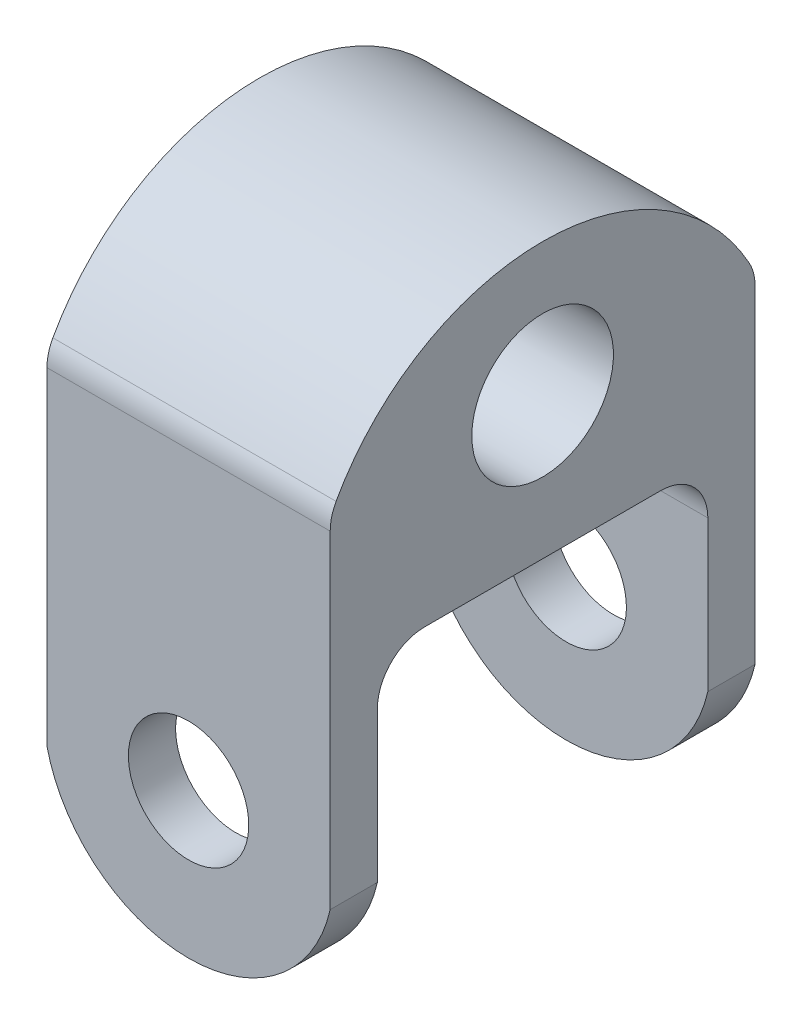
ISO-10303-21;
HEADER;
FILE_DESCRIPTION(('STEP AP214'),'2;1');
FILE_NAME('part.step','',(''),(''),'','','');
FILE_SCHEMA(('AUTOMOTIVE_DESIGN { 1 0 10303 214 1 1 1 1 }'));
ENDSEC;
DATA;
#1=APPLICATION_CONTEXT('core data for automotive mechanical design processes');
#2=APPLICATION_PROTOCOL_DEFINITION('international standard','automotive_design',2000,#1);
#3=PRODUCT_CONTEXT('',#1,'mechanical');
#4=PRODUCT('Part','Part','',(#3));
#5=PRODUCT_RELATED_PRODUCT_CATEGORY('part','',(#4));
#6=PRODUCT_DEFINITION_FORMATION('','',#4);
#7=PRODUCT_DEFINITION_CONTEXT('part definition',#1,'design');
#8=PRODUCT_DEFINITION('design','',#6,#7);
#9=PRODUCT_DEFINITION_SHAPE('','',#8);
#10=(LENGTH_UNIT() NAMED_UNIT(*) SI_UNIT(.MILLI.,.METRE.));
#11=(NAMED_UNIT(*) PLANE_ANGLE_UNIT() SI_UNIT($,.RADIAN.));
#12=(NAMED_UNIT(*) SI_UNIT($,.STERADIAN.) SOLID_ANGLE_UNIT());
#13=UNCERTAINTY_MEASURE_WITH_UNIT(LENGTH_MEASURE(1.E-05),#10,'distance_accuracy_value','');
#14=(GEOMETRIC_REPRESENTATION_CONTEXT(3) GLOBAL_UNCERTAINTY_ASSIGNED_CONTEXT((#13)) GLOBAL_UNIT_ASSIGNED_CONTEXT((#10,
#11,#12)) REPRESENTATION_CONTEXT('',''));
#15=CARTESIAN_POINT('',(0.,0.,0.));
#16=DIRECTION('',(0.,0.,1.));
#17=DIRECTION('',(1.,0.,0.));
#18=AXIS2_PLACEMENT_3D('',#15,#16,#17);
#19=CARTESIAN_POINT('',(60.,-21.7944947177034,0.));
#20=DIRECTION('',(-1.,0.,0.));
#21=DIRECTION('',(0.,0.,1.));
#22=AXIS2_PLACEMENT_3D('',#19,#20,#21);
#23=CYLINDRICAL_SURFACE('',#22,50.);
#24=CARTESIAN_POINT('',(60.,-21.7944947177034,0.));
#25=DIRECTION('',(1.,0.,0.));
#26=DIRECTION('',(0.,0.,-1.));
#27=AXIS2_PLACEMENT_3D('',#24,#25,#26);
#28=CIRCLE('',#27,50.);
#29=CARTESIAN_POINT('',(60.,2.41165119609299,43.75));
#30=VERTEX_POINT('',#29);
#31=CARTESIAN_POINT('',(60.,2.41165119609299,-43.75));
#32=VERTEX_POINT('',#31);
#33=EDGE_CURVE('E139',#30,#32,#28,.F.);
#34=ORIENTED_EDGE('',*,*,#33,.T.);
#35=DIRECTION('',(-1.,0.,0.));
#36=VECTOR('',#35,1.);
#37=CARTESIAN_POINT('',(60.,2.41165119609299,-43.75));
#38=LINE('',#37,#36);
#39=CARTESIAN_POINT('',(0.,2.41165119609299,-43.75));
#40=VERTEX_POINT('',#39);
#41=EDGE_CURVE('E210',#32,#40,#38,.T.);
#42=ORIENTED_EDGE('',*,*,#41,.T.);
#43=CARTESIAN_POINT('',(0.,-21.7944947177034,0.));
#44=DIRECTION('',(1.,0.,0.));
#45=DIRECTION('',(0.,0.,-1.));
#46=AXIS2_PLACEMENT_3D('',#43,#44,#45);
#47=CIRCLE('',#46,50.);
#48=CARTESIAN_POINT('',(0.,2.41165119609299,43.75));
#49=VERTEX_POINT('',#48);
#50=EDGE_CURVE('E176',#49,#40,#47,.F.);
#51=ORIENTED_EDGE('',*,*,#50,.F.);
#52=DIRECTION('',(-1.,0.,0.));
#53=VECTOR('',#52,1.);
#54=CARTESIAN_POINT('',(60.,2.41165119609299,43.75));
#55=LINE('',#54,#53);
#56=EDGE_CURVE('E208',#49,#30,#55,.F.);
#57=ORIENTED_EDGE('',*,*,#56,.T.);
#58=EDGE_LOOP('',(#34,#42,#51,#57));
#59=FACE_BOUND('',#58,.T.);
#60=ADVANCED_FACE('F35',(#59),#23,.T.);
#61=CARTESIAN_POINT('',(60.,0.,45.));
#62=DIRECTION('',(0.,0.,-1.));
#63=DIRECTION('',(0.,1.,0.));
#64=AXIS2_PLACEMENT_3D('',#61,#62,#63);
#65=PLANE('',#64);
#66=CARTESIAN_POINT('',(30.,-65.,45.));
#67=DIRECTION('',(0.,0.,-1.));
#68=DIRECTION('',(0.,1.,0.));
#69=AXIS2_PLACEMENT_3D('',#66,#67,#68);
#70=CIRCLE('',#69,12.75);
#71=CARTESIAN_POINT('',(30.,-52.25,45.));
#72=VERTEX_POINT('',#71);
#73=EDGE_CURVE('E165',#72,#72,#70,.T.);
#74=ORIENTED_EDGE('',*,*,#73,.T.);
#75=EDGE_LOOP('',(#74));
#76=FACE_BOUND('',#75,.T.);
#77=DIRECTION('',(0.,-1.,0.));
#78=VECTOR('',#77,1.);
#79=CARTESIAN_POINT('',(60.,0.,45.));
#80=LINE('',#79,#78);
#81=CARTESIAN_POINT('',(60.,-2.42957798666628,45.));
#82=VERTEX_POINT('',#81);
#83=CARTESIAN_POINT('',(60.,-71.8614343491003,45.));
#84=VERTEX_POINT('',#83);
#85=EDGE_CURVE('E123',#82,#84,#80,.T.);
#86=ORIENTED_EDGE('',*,*,#85,.F.);
#87=DIRECTION('',(1.,0.,0.));
#88=VECTOR('',#87,1.);
#89=CARTESIAN_POINT('',(0.,-2.42957798666628,45.));
#90=LINE('',#89,#88);
#91=CARTESIAN_POINT('',(0.,-2.42957798666628,45.));
#92=VERTEX_POINT('',#91);
#93=EDGE_CURVE('E222',#82,#92,#90,.F.);
#94=ORIENTED_EDGE('',*,*,#93,.T.);
#95=DIRECTION('',(0.,-1.,0.));
#96=VECTOR('',#95,1.);
#97=CARTESIAN_POINT('',(0.,0.,45.));
#98=LINE('',#97,#96);
#99=CARTESIAN_POINT('',(0.,-71.8614343491003,45.));
#100=VERTEX_POINT('',#99);
#101=EDGE_CURVE('E153',#92,#100,#98,.T.);
#102=ORIENTED_EDGE('',*,*,#101,.T.);
#103=CARTESIAN_POINT('',(30.,-65.,45.));
#104=DIRECTION('',(0.,0.,1.));
#105=DIRECTION('',(0.,1.,0.));
#106=AXIS2_PLACEMENT_3D('',#103,#104,#105);
#107=CIRCLE('',#106,30.7746532283796);
#108=EDGE_CURVE('E144',#100,#84,#107,.T.);
#109=ORIENTED_EDGE('',*,*,#108,.T.);
#110=EDGE_LOOP('',(#86,#94,#102,#109));
#111=FACE_BOUND('',#110,.T.);
#112=ADVANCED_FACE('F151',(#76,#111),#65,.F.);
#113=CARTESIAN_POINT('',(60.,0.,35.));
#114=DIRECTION('',(0.,0.,1.));
#115=DIRECTION('',(1.,0.,0.));
#116=AXIS2_PLACEMENT_3D('',#113,#114,#115);
#117=PLANE('',#116);
#118=CARTESIAN_POINT('',(30.,-65.,35.));
#119=DIRECTION('',(0.,0.,1.));
#120=DIRECTION('',(1.,0.,0.));
#121=AXIS2_PLACEMENT_3D('',#118,#119,#120);
#122=CIRCLE('',#121,12.75);
#123=CARTESIAN_POINT('',(42.75,-65.,35.));
#124=VERTEX_POINT('',#123);
#125=EDGE_CURVE('E173',#124,#124,#122,.T.);
#126=ORIENTED_EDGE('',*,*,#125,.T.);
#127=EDGE_LOOP('',(#126));
#128=FACE_BOUND('',#127,.T.);
#129=DIRECTION('',(0.,1.,0.));
#130=VECTOR('',#129,1.);
#131=CARTESIAN_POINT('',(0.,0.,35.));
#132=LINE('',#131,#130);
#133=CARTESIAN_POINT('',(0.,-71.8614343491003,35.));
#134=VERTEX_POINT('',#133);
#135=CARTESIAN_POINT('',(0.,-40.,35.));
#136=VERTEX_POINT('',#135);
#137=EDGE_CURVE('E194',#134,#136,#132,.T.);
#138=ORIENTED_EDGE('',*,*,#137,.T.);
#139=DIRECTION('',(-1.,0.,0.));
#140=VECTOR('',#139,1.);
#141=CARTESIAN_POINT('',(60.,-40.,35.));
#142=LINE('',#141,#140);
#143=CARTESIAN_POINT('',(60.,-40.,35.));
#144=VERTEX_POINT('',#143);
#145=EDGE_CURVE('E228',#136,#144,#142,.F.);
#146=ORIENTED_EDGE('',*,*,#145,.T.);
#147=DIRECTION('',(0.,1.,0.));
#148=VECTOR('',#147,1.);
#149=CARTESIAN_POINT('',(60.,0.,35.));
#150=LINE('',#149,#148);
#151=CARTESIAN_POINT('',(60.,-71.8614343491003,35.));
#152=VERTEX_POINT('',#151);
#153=EDGE_CURVE('E138',#152,#144,#150,.T.);
#154=ORIENTED_EDGE('',*,*,#153,.F.);
#155=CARTESIAN_POINT('',(30.,-65.,35.));
#156=DIRECTION('',(0.,0.,1.));
#157=DIRECTION('',(1.,0.,0.));
#158=AXIS2_PLACEMENT_3D('',#155,#156,#157);
#159=CIRCLE('',#158,30.7746532283796);
#160=EDGE_CURVE('E147',#152,#134,#159,.F.);
#161=ORIENTED_EDGE('',*,*,#160,.T.);
#162=EDGE_LOOP('',(#138,#146,#154,#161));
#163=FACE_BOUND('',#162,.T.);
#164=ADVANCED_FACE('F268',(#128,#163),#117,.F.);
#165=CARTESIAN_POINT('',(60.,-30.,0.));
#166=DIRECTION('',(0.,1.,0.));
#167=DIRECTION('',(0.,0.,1.));
#168=AXIS2_PLACEMENT_3D('',#165,#166,#167);
#169=PLANE('',#168);
#170=DIRECTION('',(0.,0.,-1.));
#171=VECTOR('',#170,1.);
#172=CARTESIAN_POINT('',(60.,-30.,0.));
#173=LINE('',#172,#171);
#174=CARTESIAN_POINT('',(60.,-30.,25.));
#175=VERTEX_POINT('',#174);
#176=CARTESIAN_POINT('',(60.,-30.,-25.));
#177=VERTEX_POINT('',#176);
#178=EDGE_CURVE('E181',#175,#177,#173,.T.);
#179=ORIENTED_EDGE('',*,*,#178,.F.);
#180=DIRECTION('',(-1.,0.,0.));
#181=VECTOR('',#180,1.);
#182=CARTESIAN_POINT('',(0.,-30.,25.));
#183=LINE('',#182,#181);
#184=CARTESIAN_POINT('',(0.,-30.,25.));
#185=VERTEX_POINT('',#184);
#186=EDGE_CURVE('E225',#175,#185,#183,.T.);
#187=ORIENTED_EDGE('',*,*,#186,.T.);
#188=DIRECTION('',(0.,0.,-1.));
#189=VECTOR('',#188,1.);
#190=CARTESIAN_POINT('',(0.,-30.,0.));
#191=LINE('',#190,#189);
#192=CARTESIAN_POINT('',(0.,-30.,-25.));
#193=VERTEX_POINT('',#192);
#194=EDGE_CURVE('E197',#185,#193,#191,.T.);
#195=ORIENTED_EDGE('',*,*,#194,.T.);
#196=DIRECTION('',(-1.,0.,0.));
#197=VECTOR('',#196,1.);
#198=CARTESIAN_POINT('',(60.,-30.,-25.));
#199=LINE('',#198,#197);
#200=EDGE_CURVE('E56',#193,#177,#199,.F.);
#201=ORIENTED_EDGE('',*,*,#200,.T.);
#202=EDGE_LOOP('',(#179,#187,#195,#201));
#203=FACE_BOUND('',#202,.T.);
#204=ADVANCED_FACE('F243',(#203),#169,.F.);
#205=CARTESIAN_POINT('',(60.,0.,-35.));
#206=DIRECTION('',(0.,0.,-1.));
#207=DIRECTION('',(0.,1.,0.));
#208=AXIS2_PLACEMENT_3D('',#205,#206,#207);
#209=PLANE('',#208);
#210=CARTESIAN_POINT('',(30.,-65.,-35.));
#211=DIRECTION('',(0.,0.,-1.));
#212=DIRECTION('',(0.,1.,0.));
#213=AXIS2_PLACEMENT_3D('',#210,#211,#212);
#214=CIRCLE('',#213,12.75);
#215=CARTESIAN_POINT('',(30.,-52.25,-35.));
#216=VERTEX_POINT('',#215);
#217=EDGE_CURVE('E168',#216,#216,#214,.T.);
#218=ORIENTED_EDGE('',*,*,#217,.T.);
#219=EDGE_LOOP('',(#218));
#220=FACE_BOUND('',#219,.T.);
#221=DIRECTION('',(0.,-1.,0.));
#222=VECTOR('',#221,1.);
#223=CARTESIAN_POINT('',(60.,0.,-35.));
#224=LINE('',#223,#222);
#225=CARTESIAN_POINT('',(60.,-40.,-35.));
#226=VERTEX_POINT('',#225);
#227=CARTESIAN_POINT('',(60.,-71.8614343491003,-35.));
#228=VERTEX_POINT('',#227);
#229=EDGE_CURVE('E183',#226,#228,#224,.T.);
#230=ORIENTED_EDGE('',*,*,#229,.F.);
#231=DIRECTION('',(-1.,0.,0.));
#232=VECTOR('',#231,1.);
#233=CARTESIAN_POINT('',(0.,-40.,-35.));
#234=LINE('',#233,#232);
#235=CARTESIAN_POINT('',(0.,-40.,-35.));
#236=VERTEX_POINT('',#235);
#237=EDGE_CURVE('E230',#226,#236,#234,.T.);
#238=ORIENTED_EDGE('',*,*,#237,.T.);
#239=DIRECTION('',(0.,-1.,0.));
#240=VECTOR('',#239,1.);
#241=CARTESIAN_POINT('',(0.,0.,-35.));
#242=LINE('',#241,#240);
#243=CARTESIAN_POINT('',(0.,-71.8614343491003,-35.));
#244=VERTEX_POINT('',#243);
#245=EDGE_CURVE('E199',#236,#244,#242,.T.);
#246=ORIENTED_EDGE('',*,*,#245,.T.);
#247=CARTESIAN_POINT('',(30.,-65.,-35.));
#248=DIRECTION('',(0.,0.,-1.));
#249=DIRECTION('',(0.,1.,0.));
#250=AXIS2_PLACEMENT_3D('',#247,#248,#249);
#251=CIRCLE('',#250,30.7746532283796);
#252=EDGE_CURVE('E159',#244,#228,#251,.F.);
#253=ORIENTED_EDGE('',*,*,#252,.T.);
#254=EDGE_LOOP('',(#230,#238,#246,#253));
#255=FACE_BOUND('',#254,.T.);
#256=ADVANCED_FACE('F246',(#220,#255),#209,.F.);
#257=CARTESIAN_POINT('',(60.,0.,-45.));
#258=DIRECTION('',(0.,0.,1.));
#259=DIRECTION('',(0.,-1.,0.));
#260=AXIS2_PLACEMENT_3D('',#257,#258,#259);
#261=PLANE('',#260);
#262=CARTESIAN_POINT('',(30.,-65.,-45.));
#263=DIRECTION('',(0.,0.,-1.));
#264=DIRECTION('',(0.,1.,0.));
#265=AXIS2_PLACEMENT_3D('',#262,#263,#264);
#266=CIRCLE('',#265,12.75);
#267=CARTESIAN_POINT('',(30.,-52.25,-45.));
#268=VERTEX_POINT('',#267);
#269=EDGE_CURVE('E164',#268,#268,#266,.T.);
#270=ORIENTED_EDGE('',*,*,#269,.F.);
#271=EDGE_LOOP('',(#270));
#272=FACE_BOUND('',#271,.T.);
#273=DIRECTION('',(0.,1.,0.));
#274=VECTOR('',#273,1.);
#275=CARTESIAN_POINT('',(0.,0.,-45.));
#276=LINE('',#275,#274);
#277=CARTESIAN_POINT('',(0.,-71.8614343491003,-45.));
#278=VERTEX_POINT('',#277);
#279=CARTESIAN_POINT('',(0.,-2.42957798666628,-45.));
#280=VERTEX_POINT('',#279);
#281=EDGE_CURVE('E201',#278,#280,#276,.T.);
#282=ORIENTED_EDGE('',*,*,#281,.T.);
#283=DIRECTION('',(1.,0.,0.));
#284=VECTOR('',#283,1.);
#285=CARTESIAN_POINT('',(60.,-2.42957798666628,-45.));
#286=LINE('',#285,#284);
#287=CARTESIAN_POINT('',(60.,-2.42957798666628,-45.));
#288=VERTEX_POINT('',#287);
#289=EDGE_CURVE('E217',#280,#288,#286,.T.);
#290=ORIENTED_EDGE('',*,*,#289,.T.);
#291=DIRECTION('',(0.,1.,0.));
#292=VECTOR('',#291,1.);
#293=CARTESIAN_POINT('',(60.,0.,-45.));
#294=LINE('',#293,#292);
#295=CARTESIAN_POINT('',(60.,-71.8614343491003,-45.));
#296=VERTEX_POINT('',#295);
#297=EDGE_CURVE('E185',#296,#288,#294,.T.);
#298=ORIENTED_EDGE('',*,*,#297,.F.);
#299=CARTESIAN_POINT('',(30.,-65.,-45.));
#300=DIRECTION('',(0.,0.,1.));
#301=DIRECTION('',(0.,1.,0.));
#302=AXIS2_PLACEMENT_3D('',#299,#300,#301);
#303=CIRCLE('',#302,30.7746532283796);
#304=EDGE_CURVE('E154',#278,#296,#303,.T.);
#305=ORIENTED_EDGE('',*,*,#304,.F.);
#306=EDGE_LOOP('',(#282,#290,#298,#305));
#307=FACE_BOUND('',#306,.T.);
#308=ADVANCED_FACE('F255',(#272,#307),#261,.F.);
#309=CARTESIAN_POINT('',(60.,0.,0.));
#310=DIRECTION('',(-1.,0.,0.));
#311=DIRECTION('',(0.,0.,1.));
#312=AXIS2_PLACEMENT_3D('',#309,#310,#311);
#313=CYLINDRICAL_SURFACE('',#312,15.);
#314=CARTESIAN_POINT('',(60.,0.,0.));
#315=DIRECTION('',(1.,0.,0.));
#316=DIRECTION('',(0.,0.,-1.));
#317=AXIS2_PLACEMENT_3D('',#314,#315,#316);
#318=CIRCLE('',#317,15.);
#319=CARTESIAN_POINT('',(60.,0.,15.));
#320=VERTEX_POINT('',#319);
#321=EDGE_CURVE('E187',#320,#320,#318,.T.);
#322=CARTESIAN_POINT('',(0.,0.,0.));
#323=DIRECTION('',(1.,0.,0.));
#324=DIRECTION('',(0.,0.,-1.));
#325=AXIS2_PLACEMENT_3D('',#322,#323,#324);
#326=CIRCLE('',#325,15.);
#327=CARTESIAN_POINT('',(0.,0.,15.));
#328=VERTEX_POINT('',#327);
#329=EDGE_CURVE('E178',#328,#328,#326,.T.);
#330=CARTESIAN_POINT('',(60.,0.,15.));
#331=CARTESIAN_POINT('',(59.375,0.,15.));
#332=CARTESIAN_POINT('',(58.75,0.,15.));
#333=CARTESIAN_POINT('',(57.5,0.,15.));
#334=CARTESIAN_POINT('',(56.875,0.,15.));
#335=CARTESIAN_POINT('',(55.625,0.,15.));
#336=CARTESIAN_POINT('',(55.,0.,15.));
#337=CARTESIAN_POINT('',(53.75,0.,15.));
#338=CARTESIAN_POINT('',(53.125,0.,15.));
#339=CARTESIAN_POINT('',(51.875,0.,15.));
#340=CARTESIAN_POINT('',(51.25,0.,15.));
#341=CARTESIAN_POINT('',(50.,0.,15.));
#342=CARTESIAN_POINT('',(49.375,0.,15.));
#343=CARTESIAN_POINT('',(48.125,0.,15.));
#344=CARTESIAN_POINT('',(47.5,0.,15.));
#345=CARTESIAN_POINT('',(46.25,0.,15.));
#346=CARTESIAN_POINT('',(45.625,0.,15.));
#347=CARTESIAN_POINT('',(44.375,0.,15.));
#348=CARTESIAN_POINT('',(43.75,0.,15.));
#349=CARTESIAN_POINT('',(42.5,0.,15.));
#350=CARTESIAN_POINT('',(41.875,0.,15.));
#351=CARTESIAN_POINT('',(40.625,0.,15.));
#352=CARTESIAN_POINT('',(40.,0.,15.));
#353=CARTESIAN_POINT('',(38.75,0.,15.));
#354=CARTESIAN_POINT('',(38.125,0.,15.));
#355=CARTESIAN_POINT('',(36.875,0.,15.));
#356=CARTESIAN_POINT('',(36.25,0.,15.));
#357=CARTESIAN_POINT('',(35.,0.,15.));
#358=CARTESIAN_POINT('',(34.375,0.,15.));
#359=CARTESIAN_POINT('',(33.125,0.,15.));
#360=CARTESIAN_POINT('',(32.5,0.,15.));
#361=CARTESIAN_POINT('',(31.25,0.,15.));
#362=CARTESIAN_POINT('',(30.625,0.,15.));
#363=CARTESIAN_POINT('',(29.375,0.,15.));
#364=CARTESIAN_POINT('',(28.75,0.,15.));
#365=CARTESIAN_POINT('',(27.5,0.,15.));
#366=CARTESIAN_POINT('',(26.875,0.,15.));
#367=CARTESIAN_POINT('',(25.625,0.,15.));
#368=CARTESIAN_POINT('',(25.,0.,15.));
#369=CARTESIAN_POINT('',(23.75,0.,15.));
#370=CARTESIAN_POINT('',(23.125,0.,15.));
#371=CARTESIAN_POINT('',(21.875,0.,15.));
#372=CARTESIAN_POINT('',(21.25,0.,15.));
#373=CARTESIAN_POINT('',(20.,0.,15.));
#374=CARTESIAN_POINT('',(19.375,0.,15.));
#375=CARTESIAN_POINT('',(18.125,0.,15.));
#376=CARTESIAN_POINT('',(17.5,0.,15.));
#377=CARTESIAN_POINT('',(16.25,0.,15.));
#378=CARTESIAN_POINT('',(15.625,0.,15.));
#379=CARTESIAN_POINT('',(14.375,0.,15.));
#380=CARTESIAN_POINT('',(13.75,0.,15.));
#381=CARTESIAN_POINT('',(12.5,0.,15.));
#382=CARTESIAN_POINT('',(11.875,0.,15.));
#383=CARTESIAN_POINT('',(10.625,0.,15.));
#384=CARTESIAN_POINT('',(10.,0.,15.));
#385=CARTESIAN_POINT('',(8.75,0.,15.));
#386=CARTESIAN_POINT('',(8.125,0.,15.));
#387=CARTESIAN_POINT('',(6.875,0.,15.));
#388=CARTESIAN_POINT('',(6.25,0.,15.));
#389=CARTESIAN_POINT('',(5.,0.,15.));
#390=CARTESIAN_POINT('',(4.375,0.,15.));
#391=CARTESIAN_POINT('',(3.125,0.,15.));
#392=CARTESIAN_POINT('',(2.5,0.,15.));
#393=CARTESIAN_POINT('',(1.25,0.,15.));
#394=CARTESIAN_POINT('',(0.625000000000001,0.,15.));
#395=CARTESIAN_POINT('',(0.,0.,15.));
#396=B_SPLINE_CURVE_WITH_KNOTS('',3,(#330,#331,#332,#333,#334,#335,#336,#337,#338,#339,#340,
#341,#342,#343,#344,#345,#346,#347,#348,#349,#350,#351,#352,#353,#354,#355,#356,#357,#358,#359,
#360,#361,#362,#363,#364,#365,#366,#367,#368,#369,#370,#371,#372,#373,#374,#375,#376,#377,#378,
#379,#380,#381,#382,#383,#384,#385,#386,#387,#388,#389,#390,#391,#392,#393,#394,#395),
.UNSPECIFIED.,.F.,.F.,(4,2,2,2,2,2,2,2,2,2,2,2,2,2,2,2,2,2,2,2,2,2,2,2,2,2,2,2,2,2,2,2,4),(0.,
1.875,3.75,5.62500000000001,7.50000000000001,9.375,11.25,13.125,15.,16.875,18.75,20.625,22.5,
24.375,26.25,28.125,30.,31.875,33.75,35.625,37.5,39.375,41.25,43.125,45.,46.875,48.75,50.625,
52.5,54.375,56.25,58.125,60.),.UNSPECIFIED.);
#397=EDGE_CURVE('BSEAM304',#320,#328,#396,.T.);
#398=ORIENTED_EDGE('',*,*,#321,.T.);
#399=ORIENTED_EDGE('',*,*,#329,.F.);
#400=ORIENTED_EDGE('',*,*,#397,.T.);
#401=ORIENTED_EDGE('',*,*,#397,.F.);
#402=EDGE_LOOP('',(#398,#400,#399,#401));
#403=FACE_BOUND('',#402,.T.);
#404=ADVANCED_FACE('F304',(#403),#313,.F.);
#405=CARTESIAN_POINT('',(60.,0.,0.));
#406=DIRECTION('',(1.,0.,0.));
#407=DIRECTION('',(0.,0.,-1.));
#408=AXIS2_PLACEMENT_3D('',#405,#406,#407);
#409=PLANE('',#408);
#410=ORIENTED_EDGE('',*,*,#297,.T.);
#411=CARTESIAN_POINT('',(60.,-2.42957798666628,-35.));
#412=DIRECTION('',(1.,0.,0.));
#413=DIRECTION('',(0.,0.,-1.));
#414=AXIS2_PLACEMENT_3D('',#411,#412,#413);
#415=CIRCLE('',#414,10.);
#416=EDGE_CURVE('E220',#288,#32,#415,.T.);
#417=ORIENTED_EDGE('',*,*,#416,.T.);
#418=ORIENTED_EDGE('',*,*,#33,.F.);
#419=CARTESIAN_POINT('',(60.,-2.42957798666628,35.));
#420=DIRECTION('',(1.,0.,0.));
#421=DIRECTION('',(0.,0.,-1.));
#422=AXIS2_PLACEMENT_3D('',#419,#420,#421);
#423=CIRCLE('',#422,10.);
#424=EDGE_CURVE('E133',#30,#82,#423,.T.);
#425=ORIENTED_EDGE('',*,*,#424,.T.);
#426=ORIENTED_EDGE('',*,*,#85,.T.);
#427=DIRECTION('',(0.,0.,-1.));
#428=VECTOR('',#427,1.);
#429=CARTESIAN_POINT('',(60.,-71.8614343491003,45.));
#430=LINE('',#429,#428);
#431=EDGE_CURVE('E129',#84,#152,#430,.T.);
#432=ORIENTED_EDGE('',*,*,#431,.T.);
#433=ORIENTED_EDGE('',*,*,#153,.T.);
#434=CARTESIAN_POINT('',(60.,-40.,25.));
#435=DIRECTION('',(1.,0.,0.));
#436=DIRECTION('',(0.,0.,-1.));
#437=AXIS2_PLACEMENT_3D('',#434,#435,#436);
#438=CIRCLE('',#437,10.);
#439=EDGE_CURVE('E235',#144,#175,#438,.F.);
#440=ORIENTED_EDGE('',*,*,#439,.T.);
#441=ORIENTED_EDGE('',*,*,#178,.T.);
#442=CARTESIAN_POINT('',(60.,-40.,-25.));
#443=DIRECTION('',(1.,0.,0.));
#444=DIRECTION('',(0.,0.,-1.));
#445=AXIS2_PLACEMENT_3D('',#442,#443,#444);
#446=CIRCLE('',#445,10.);
#447=EDGE_CURVE('E11',#177,#226,#446,.F.);
#448=ORIENTED_EDGE('',*,*,#447,.T.);
#449=ORIENTED_EDGE('',*,*,#229,.T.);
#450=EDGE_CURVE('E149',#228,#296,#430,.T.);
#451=ORIENTED_EDGE('',*,*,#450,.T.);
#452=EDGE_LOOP('',(#410,#417,#418,#425,#426,#432,#433,#440,#441,#448,#449,#451));
#453=FACE_BOUND('',#452,.T.);
#454=ORIENTED_EDGE('',*,*,#321,.F.);
#455=EDGE_LOOP('',(#454));
#456=FACE_BOUND('',#455,.T.);
#457=ADVANCED_FACE('F126',(#453,#456),#409,.T.);
#458=CARTESIAN_POINT('',(0.,0.,0.));
#459=DIRECTION('',(1.,0.,0.));
#460=DIRECTION('',(0.,0.,-1.));
#461=AXIS2_PLACEMENT_3D('',#458,#459,#460);
#462=PLANE('',#461);
#463=ORIENTED_EDGE('',*,*,#50,.T.);
#464=CARTESIAN_POINT('',(0.,-2.42957798666628,-35.));
#465=DIRECTION('',(1.,0.,0.));
#466=DIRECTION('',(0.,0.,-1.));
#467=AXIS2_PLACEMENT_3D('',#464,#465,#466);
#468=CIRCLE('',#467,10.);
#469=EDGE_CURVE('E215',#40,#280,#468,.F.);
#470=ORIENTED_EDGE('',*,*,#469,.T.);
#471=ORIENTED_EDGE('',*,*,#281,.F.);
#472=DIRECTION('',(0.,0.,1.));
#473=VECTOR('',#472,1.);
#474=CARTESIAN_POINT('',(0.,-71.8614343491003,0.));
#475=LINE('',#474,#473);
#476=EDGE_CURVE('E190',#278,#244,#475,.T.);
#477=ORIENTED_EDGE('',*,*,#476,.T.);
#478=ORIENTED_EDGE('',*,*,#245,.F.);
#479=CARTESIAN_POINT('',(0.,-40.,-25.));
#480=DIRECTION('',(1.,0.,0.));
#481=DIRECTION('',(0.,0.,-1.));
#482=AXIS2_PLACEMENT_3D('',#479,#480,#481);
#483=CIRCLE('',#482,10.);
#484=EDGE_CURVE('E43',#236,#193,#483,.T.);
#485=ORIENTED_EDGE('',*,*,#484,.T.);
#486=ORIENTED_EDGE('',*,*,#194,.F.);
#487=CARTESIAN_POINT('',(0.,-40.,25.));
#488=DIRECTION('',(1.,0.,0.));
#489=DIRECTION('',(0.,0.,-1.));
#490=AXIS2_PLACEMENT_3D('',#487,#488,#489);
#491=CIRCLE('',#490,10.);
#492=EDGE_CURVE('E233',#185,#136,#491,.T.);
#493=ORIENTED_EDGE('',*,*,#492,.T.);
#494=ORIENTED_EDGE('',*,*,#137,.F.);
#495=DIRECTION('',(0.,0.,-1.));
#496=VECTOR('',#495,1.);
#497=CARTESIAN_POINT('',(0.,-71.8614343491003,45.));
#498=LINE('',#497,#496);
#499=EDGE_CURVE('E148',#100,#134,#498,.T.);
#500=ORIENTED_EDGE('',*,*,#499,.F.);
#501=ORIENTED_EDGE('',*,*,#101,.F.);
#502=CARTESIAN_POINT('',(0.,-2.42957798666628,35.));
#503=DIRECTION('',(1.,0.,0.));
#504=DIRECTION('',(0.,0.,-1.));
#505=AXIS2_PLACEMENT_3D('',#502,#503,#504);
#506=CIRCLE('',#505,10.);
#507=EDGE_CURVE('E213',#92,#49,#506,.F.);
#508=ORIENTED_EDGE('',*,*,#507,.T.);
#509=EDGE_LOOP('',(#463,#470,#471,#477,#478,#485,#486,#493,#494,#500,#501,#508));
#510=FACE_BOUND('',#509,.T.);
#511=ORIENTED_EDGE('',*,*,#329,.T.);
#512=EDGE_LOOP('',(#511));
#513=FACE_BOUND('',#512,.T.);
#514=ADVANCED_FACE('F239',(#510,#513),#462,.F.);
#515=CARTESIAN_POINT('',(30.,-65.,45.));
#516=DIRECTION('',(0.,0.,-1.));
#517=DIRECTION('',(0.,1.,0.));
#518=AXIS2_PLACEMENT_3D('',#515,#516,#517);
#519=CYLINDRICAL_SURFACE('',#518,12.75);
#520=ORIENTED_EDGE('',*,*,#269,.T.);
#521=EDGE_LOOP('',(#520));
#522=FACE_BOUND('',#521,.T.);
#523=ORIENTED_EDGE('',*,*,#217,.F.);
#524=EDGE_LOOP('',(#523));
#525=FACE_BOUND('',#524,.T.);
#526=ADVANCED_FACE('F300',(#522,#525),#519,.F.);
#527=ORIENTED_EDGE('',*,*,#73,.F.);
#528=EDGE_LOOP('',(#527));
#529=FACE_BOUND('',#528,.T.);
#530=ORIENTED_EDGE('',*,*,#125,.F.);
#531=EDGE_LOOP('',(#530));
#532=FACE_BOUND('',#531,.T.);
#533=ADVANCED_FACE('F296',(#529,#532),#519,.F.);
#534=CARTESIAN_POINT('',(30.,-65.,45.));
#535=DIRECTION('',(0.,0.,-1.));
#536=DIRECTION('',(0.,1.,0.));
#537=AXIS2_PLACEMENT_3D('',#534,#535,#536);
#538=CYLINDRICAL_SURFACE('',#537,30.7746532283796);
#539=ORIENTED_EDGE('',*,*,#431,.F.);
#540=ORIENTED_EDGE('',*,*,#108,.F.);
#541=ORIENTED_EDGE('',*,*,#499,.T.);
#542=ORIENTED_EDGE('',*,*,#160,.F.);
#543=EDGE_LOOP('',(#539,#540,#541,#542));
#544=FACE_BOUND('',#543,.T.);
#545=ADVANCED_FACE('F143',(#544),#538,.T.);
#546=ORIENTED_EDGE('',*,*,#476,.F.);
#547=ORIENTED_EDGE('',*,*,#304,.T.);
#548=ORIENTED_EDGE('',*,*,#450,.F.);
#549=ORIENTED_EDGE('',*,*,#252,.F.);
#550=EDGE_LOOP('',(#546,#547,#548,#549));
#551=FACE_BOUND('',#550,.T.);
#552=ADVANCED_FACE('F251',(#551),#538,.T.);
#553=CARTESIAN_POINT('',(60.,-2.42957798666628,-35.));
#554=DIRECTION('',(-1.,0.,0.));
#555=DIRECTION('',(0.,0.,1.));
#556=AXIS2_PLACEMENT_3D('',#553,#554,#555);
#557=CYLINDRICAL_SURFACE('',#556,10.);
#558=ORIENTED_EDGE('',*,*,#416,.F.);
#559=ORIENTED_EDGE('',*,*,#289,.F.);
#560=ORIENTED_EDGE('',*,*,#469,.F.);
#561=ORIENTED_EDGE('',*,*,#41,.F.);
#562=EDGE_LOOP('',(#558,#559,#560,#561));
#563=FACE_BOUND('',#562,.T.);
#564=ADVANCED_FACE('F261',(#563),#557,.T.);
#565=CARTESIAN_POINT('',(60.,-2.42957798666628,35.));
#566=DIRECTION('',(-1.,0.,0.));
#567=DIRECTION('',(0.,0.,1.));
#568=AXIS2_PLACEMENT_3D('',#565,#566,#567);
#569=CYLINDRICAL_SURFACE('',#568,10.);
#570=ORIENTED_EDGE('',*,*,#424,.F.);
#571=ORIENTED_EDGE('',*,*,#56,.F.);
#572=ORIENTED_EDGE('',*,*,#507,.F.);
#573=ORIENTED_EDGE('',*,*,#93,.F.);
#574=EDGE_LOOP('',(#570,#571,#572,#573));
#575=FACE_BOUND('',#574,.T.);
#576=ADVANCED_FACE('F265',(#575),#569,.T.);
#577=CARTESIAN_POINT('',(60.,-40.,25.));
#578=DIRECTION('',(1.,0.,0.));
#579=DIRECTION('',(0.,0.,-1.));
#580=AXIS2_PLACEMENT_3D('',#577,#578,#579);
#581=CYLINDRICAL_SURFACE('',#580,10.);
#582=ORIENTED_EDGE('',*,*,#439,.F.);
#583=ORIENTED_EDGE('',*,*,#145,.F.);
#584=ORIENTED_EDGE('',*,*,#492,.F.);
#585=ORIENTED_EDGE('',*,*,#186,.F.);
#586=EDGE_LOOP('',(#582,#583,#584,#585));
#587=FACE_BOUND('',#586,.T.);
#588=ADVANCED_FACE('F272',(#587),#581,.F.);
#589=CARTESIAN_POINT('',(60.,-40.,-25.));
#590=DIRECTION('',(1.,0.,0.));
#591=DIRECTION('',(0.,0.,-1.));
#592=AXIS2_PLACEMENT_3D('',#589,#590,#591);
#593=CYLINDRICAL_SURFACE('',#592,10.);
#594=ORIENTED_EDGE('',*,*,#447,.F.);
#595=ORIENTED_EDGE('',*,*,#200,.F.);
#596=ORIENTED_EDGE('',*,*,#484,.F.);
#597=ORIENTED_EDGE('',*,*,#237,.F.);
#598=EDGE_LOOP('',(#594,#595,#596,#597));
#599=FACE_BOUND('',#598,.T.);
#600=ADVANCED_FACE('F37',(#599),#593,.F.);
#601=CLOSED_SHELL('',(#60,#112,#164,#204,#256,#308,#404,#457,#514,#526,#533,#545,#552,#564,#576,
#588,#600));
#602=MANIFOLD_SOLID_BREP('B2',#601);
#603=ADVANCED_BREP_SHAPE_REPRESENTATION('',(#18,#602),#14);
#604=SHAPE_DEFINITION_REPRESENTATION(#9,#603);
ENDSEC;
END-ISO-10303-21;
